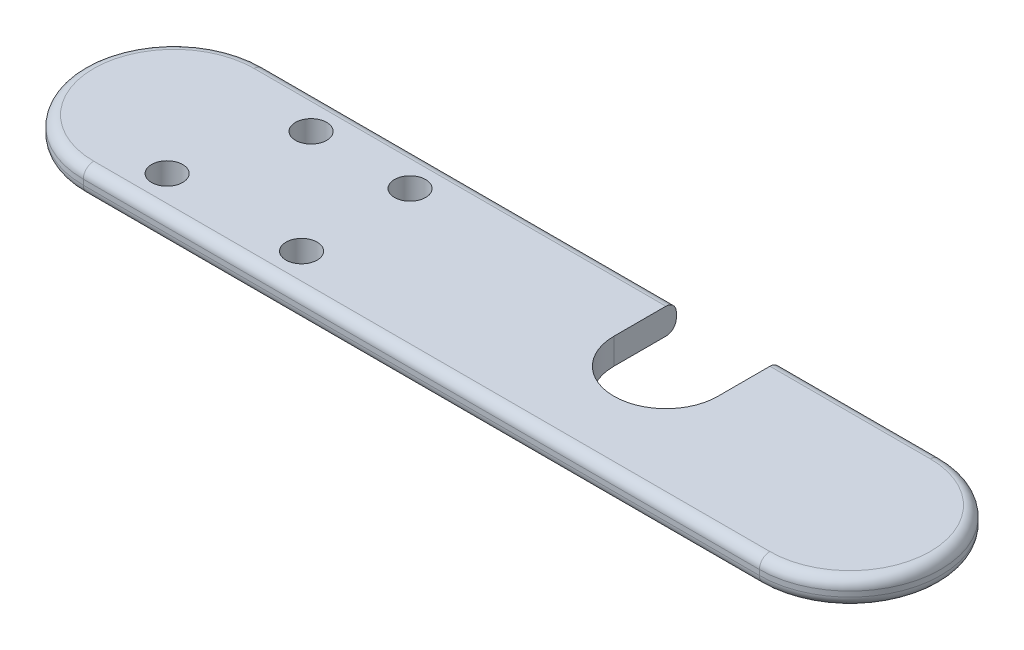
ISO-10303-21;
HEADER;
FILE_DESCRIPTION(('STEP AP214'),'2;1');
FILE_NAME('part.step','',(''),(''),'','','');
FILE_SCHEMA(('AUTOMOTIVE_DESIGN { 1 0 10303 214 1 1 1 1 }'));
ENDSEC;
DATA;
#1=APPLICATION_CONTEXT('core data for automotive mechanical design processes');
#2=APPLICATION_PROTOCOL_DEFINITION('international standard','automotive_design',2000,#1);
#3=PRODUCT_CONTEXT('',#1,'mechanical');
#4=PRODUCT('Part','Part','',(#3));
#5=PRODUCT_RELATED_PRODUCT_CATEGORY('part','',(#4));
#6=PRODUCT_DEFINITION_FORMATION('','',#4);
#7=PRODUCT_DEFINITION_CONTEXT('part definition',#1,'design');
#8=PRODUCT_DEFINITION('design','',#6,#7);
#9=PRODUCT_DEFINITION_SHAPE('','',#8);
#10=(LENGTH_UNIT() NAMED_UNIT(*) SI_UNIT(.MILLI.,.METRE.));
#11=(NAMED_UNIT(*) PLANE_ANGLE_UNIT() SI_UNIT($,.RADIAN.));
#12=(NAMED_UNIT(*) SI_UNIT($,.STERADIAN.) SOLID_ANGLE_UNIT());
#13=UNCERTAINTY_MEASURE_WITH_UNIT(LENGTH_MEASURE(1.E-05),#10,'distance_accuracy_value','');
#14=(GEOMETRIC_REPRESENTATION_CONTEXT(3) GLOBAL_UNCERTAINTY_ASSIGNED_CONTEXT((#13)) GLOBAL_UNIT_ASSIGNED_CONTEXT((#10,
#11,#12)) REPRESENTATION_CONTEXT('',''));
#15=CARTESIAN_POINT('',(0.,0.,0.));
#16=DIRECTION('',(0.,0.,1.));
#17=DIRECTION('',(1.,0.,0.));
#18=AXIS2_PLACEMENT_3D('',#15,#16,#17);
#19=CARTESIAN_POINT('',(-65.005,2.5,-17.43));
#20=DIRECTION('',(0.,0.,1.));
#21=DIRECTION('',(1.,0.,0.));
#22=AXIS2_PLACEMENT_3D('',#19,#20,#21);
#23=PLANE('',#22);
#24=DIRECTION('',(-1.,0.,0.));
#25=VECTOR('',#24,1.);
#26=CARTESIAN_POINT('',(-65.005,-0.5,-17.43));
#27=LINE('',#26,#25);
#28=CARTESIAN_POINT('',(65.005,-0.5,-17.43));
#29=VERTEX_POINT('',#28);
#30=CARTESIAN_POINT('',(34.165,-0.5,-17.43));
#31=VERTEX_POINT('',#30);
#32=EDGE_CURVE('E253',#29,#31,#27,.T.);
#33=ORIENTED_EDGE('',*,*,#32,.T.);
#34=DIRECTION('',(0.,1.,0.));
#35=VECTOR('',#34,1.);
#36=CARTESIAN_POINT('',(34.165,-7.5,-17.43));
#37=LINE('',#36,#35);
#38=CARTESIAN_POINT('',(34.165,0.5,-17.43));
#39=VERTEX_POINT('',#38);
#40=EDGE_CURVE('E172',#31,#39,#37,.T.);
#41=ORIENTED_EDGE('',*,*,#40,.T.);
#42=DIRECTION('',(-1.,0.,0.));
#43=VECTOR('',#42,1.);
#44=CARTESIAN_POINT('',(65.005,0.5,-17.43));
#45=LINE('',#44,#43);
#46=CARTESIAN_POINT('',(65.005,0.5,-17.43));
#47=VERTEX_POINT('',#46);
#48=EDGE_CURVE('E257',#39,#47,#45,.F.);
#49=ORIENTED_EDGE('',*,*,#48,.T.);
#50=DIRECTION('',(0.,-1.,0.));
#51=VECTOR('',#50,1.);
#52=CARTESIAN_POINT('',(65.005,2.5,-17.43));
#53=LINE('',#52,#51);
#54=EDGE_CURVE('E228',#47,#29,#53,.T.);
#55=ORIENTED_EDGE('',*,*,#54,.T.);
#56=EDGE_LOOP('',(#33,#41,#49,#55));
#57=FACE_BOUND('',#56,.T.);
#58=ADVANCED_FACE('F39',(#57),#23,.F.);
#59=CARTESIAN_POINT('',(-65.005,0.5,-15.43));
#60=DIRECTION('',(1.,0.,0.));
#61=DIRECTION('',(0.,0.,-1.));
#62=AXIS2_PLACEMENT_3D('',#59,#60,#61);
#63=CYLINDRICAL_SURFACE('',#62,2.);
#64=CARTESIAN_POINT('',(34.165,0.5,-15.43));
#65=DIRECTION('',(1.,0.,0.));
#66=DIRECTION('',(0.,0.,-1.));
#67=AXIS2_PLACEMENT_3D('',#64,#65,#66);
#68=CIRCLE('',#67,2.);
#69=CARTESIAN_POINT('',(34.165,2.5,-15.43));
#70=VERTEX_POINT('',#69);
#71=EDGE_CURVE('E188',#70,#39,#68,.F.);
#72=ORIENTED_EDGE('',*,*,#71,.F.);
#73=DIRECTION('',(-1.,0.,0.));
#74=VECTOR('',#73,1.);
#75=CARTESIAN_POINT('',(-65.005,2.5,-15.43));
#76=LINE('',#75,#74);
#77=CARTESIAN_POINT('',(65.005,2.5,-15.43));
#78=VERTEX_POINT('',#77);
#79=EDGE_CURVE('E249',#78,#70,#76,.T.);
#80=ORIENTED_EDGE('',*,*,#79,.F.);
#81=CARTESIAN_POINT('',(65.005,0.5,-15.43));
#82=DIRECTION('',(-1.,0.,0.));
#83=DIRECTION('',(0.,0.,1.));
#84=AXIS2_PLACEMENT_3D('',#81,#82,#83);
#85=CIRCLE('',#84,2.);
#86=EDGE_CURVE('E298',#78,#47,#85,.T.);
#87=ORIENTED_EDGE('',*,*,#86,.T.);
#88=ORIENTED_EDGE('',*,*,#48,.F.);
#89=EDGE_LOOP('',(#72,#80,#87,#88));
#90=FACE_BOUND('',#89,.T.);
#91=ADVANCED_FACE('F366',(#90),#63,.T.);
#92=CARTESIAN_POINT('',(-65.005,-0.5,-15.43));
#93=DIRECTION('',(-1.,0.,0.));
#94=DIRECTION('',(0.,0.,1.));
#95=AXIS2_PLACEMENT_3D('',#92,#93,#94);
#96=CYLINDRICAL_SURFACE('',#95,2.);
#97=CARTESIAN_POINT('',(34.165,-0.5,-15.43));
#98=DIRECTION('',(1.,0.,0.));
#99=DIRECTION('',(0.,0.,-1.));
#100=AXIS2_PLACEMENT_3D('',#97,#98,#99);
#101=CIRCLE('',#100,2.);
#102=CARTESIAN_POINT('',(34.165,-2.5,-15.43));
#103=VERTEX_POINT('',#102);
#104=EDGE_CURVE('E48',#31,#103,#101,.F.);
#105=ORIENTED_EDGE('',*,*,#104,.F.);
#106=ORIENTED_EDGE('',*,*,#32,.F.);
#107=CARTESIAN_POINT('',(65.005,-0.5,-15.43));
#108=DIRECTION('',(-1.,0.,0.));
#109=DIRECTION('',(0.,0.,1.));
#110=AXIS2_PLACEMENT_3D('',#107,#108,#109);
#111=CIRCLE('',#110,2.);
#112=CARTESIAN_POINT('',(65.005,-2.5,-15.43));
#113=VERTEX_POINT('',#112);
#114=EDGE_CURVE('E313',#29,#113,#111,.T.);
#115=ORIENTED_EDGE('',*,*,#114,.T.);
#116=DIRECTION('',(-1.,0.,0.));
#117=VECTOR('',#116,1.);
#118=CARTESIAN_POINT('',(-65.005,-2.5,-15.43));
#119=LINE('',#118,#117);
#120=EDGE_CURVE('E277',#103,#113,#119,.F.);
#121=ORIENTED_EDGE('',*,*,#120,.F.);
#122=EDGE_LOOP('',(#105,#106,#115,#121));
#123=FACE_BOUND('',#122,.T.);
#124=ADVANCED_FACE('F335',(#123),#96,.T.);
#125=CARTESIAN_POINT('',(-65.005,2.5,0.));
#126=DIRECTION('',(0.,-1.,0.));
#127=DIRECTION('',(0.,0.,-1.));
#128=AXIS2_PLACEMENT_3D('',#125,#126,#127);
#129=CYLINDRICAL_SURFACE('',#128,17.43);
#130=DIRECTION('',(0.,-1.,0.));
#131=VECTOR('',#130,1.);
#132=CARTESIAN_POINT('',(-65.005,2.5,17.43));
#133=LINE('',#132,#131);
#134=CARTESIAN_POINT('',(-65.005,0.5,17.43));
#135=VERTEX_POINT('',#134);
#136=CARTESIAN_POINT('',(-65.005,-0.5,17.43));
#137=VERTEX_POINT('',#136);
#138=EDGE_CURVE('E236',#135,#137,#133,.T.);
#139=ORIENTED_EDGE('',*,*,#138,.F.);
#140=CARTESIAN_POINT('',(-65.005,0.5,0.));
#141=DIRECTION('',(0.,1.,0.));
#142=DIRECTION('',(0.,0.,1.));
#143=AXIS2_PLACEMENT_3D('',#140,#141,#142);
#144=CIRCLE('',#143,17.43);
#145=CARTESIAN_POINT('',(-65.005,0.5,-17.43));
#146=VERTEX_POINT('',#145);
#147=EDGE_CURVE('E290',#135,#146,#144,.F.);
#148=ORIENTED_EDGE('',*,*,#147,.T.);
#149=DIRECTION('',(0.,-1.,0.));
#150=VECTOR('',#149,1.);
#151=CARTESIAN_POINT('',(-65.005,2.5,-17.43));
#152=LINE('',#151,#150);
#153=CARTESIAN_POINT('',(-65.005,-0.5,-17.43));
#154=VERTEX_POINT('',#153);
#155=EDGE_CURVE('E225',#146,#154,#152,.T.);
#156=ORIENTED_EDGE('',*,*,#155,.T.);
#157=CARTESIAN_POINT('',(-65.005,-0.5,0.));
#158=DIRECTION('',(0.,1.,0.));
#159=DIRECTION('',(0.,0.,1.));
#160=AXIS2_PLACEMENT_3D('',#157,#158,#159);
#161=CIRCLE('',#160,17.43);
#162=EDGE_CURVE('E63',#154,#137,#161,.T.);
#163=ORIENTED_EDGE('',*,*,#162,.T.);
#164=EDGE_LOOP('',(#139,#148,#156,#163));
#165=FACE_BOUND('',#164,.T.);
#166=ADVANCED_FACE('F389',(#165),#129,.T.);
#167=CARTESIAN_POINT('',(-65.005,2.5,17.43));
#168=DIRECTION('',(0.,0.,-1.));
#169=DIRECTION('',(-1.,0.,0.));
#170=AXIS2_PLACEMENT_3D('',#167,#168,#169);
#171=PLANE('',#170);
#172=DIRECTION('',(0.,-1.,0.));
#173=VECTOR('',#172,1.);
#174=CARTESIAN_POINT('',(65.005,2.5,17.4299999999999));
#175=LINE('',#174,#173);
#176=CARTESIAN_POINT('',(65.005,0.5,17.4299999999999));
#177=VERTEX_POINT('',#176);
#178=CARTESIAN_POINT('',(65.005,-0.5,17.4299999999999));
#179=VERTEX_POINT('',#178);
#180=EDGE_CURVE('E232',#177,#179,#175,.T.);
#181=ORIENTED_EDGE('',*,*,#180,.F.);
#182=DIRECTION('',(1.,0.,0.));
#183=VECTOR('',#182,1.);
#184=CARTESIAN_POINT('',(-65.005,0.5,17.43));
#185=LINE('',#184,#183);
#186=EDGE_CURVE('E285',#177,#135,#185,.F.);
#187=ORIENTED_EDGE('',*,*,#186,.T.);
#188=ORIENTED_EDGE('',*,*,#138,.T.);
#189=DIRECTION('',(1.,0.,0.));
#190=VECTOR('',#189,1.);
#191=CARTESIAN_POINT('',(-65.005,-0.5,17.43));
#192=LINE('',#191,#190);
#193=EDGE_CURVE('E282',#137,#179,#192,.T.);
#194=ORIENTED_EDGE('',*,*,#193,.T.);
#195=EDGE_LOOP('',(#181,#187,#188,#194));
#196=FACE_BOUND('',#195,.T.);
#197=ADVANCED_FACE('F392',(#196),#171,.F.);
#198=CARTESIAN_POINT('',(65.005,2.5,0.));
#199=DIRECTION('',(0.,-1.,0.));
#200=DIRECTION('',(0.,0.,-1.));
#201=AXIS2_PLACEMENT_3D('',#198,#199,#200);
#202=CYLINDRICAL_SURFACE('',#201,17.43);
#203=ORIENTED_EDGE('',*,*,#54,.F.);
#204=CARTESIAN_POINT('',(65.005,0.5,0.));
#205=DIRECTION('',(0.,1.,0.));
#206=DIRECTION('',(0.,0.,1.));
#207=AXIS2_PLACEMENT_3D('',#204,#205,#206);
#208=CIRCLE('',#207,17.43);
#209=EDGE_CURVE('E265',#47,#177,#208,.F.);
#210=ORIENTED_EDGE('',*,*,#209,.T.);
#211=ORIENTED_EDGE('',*,*,#180,.T.);
#212=CARTESIAN_POINT('',(65.005,-0.5,0.));
#213=DIRECTION('',(0.,1.,0.));
#214=DIRECTION('',(0.,0.,1.));
#215=AXIS2_PLACEMENT_3D('',#212,#213,#214);
#216=CIRCLE('',#215,17.43);
#217=EDGE_CURVE('E262',#179,#29,#216,.T.);
#218=ORIENTED_EDGE('',*,*,#217,.T.);
#219=EDGE_LOOP('',(#203,#210,#211,#218));
#220=FACE_BOUND('',#219,.T.);
#221=ADVANCED_FACE('F393',(#220),#202,.T.);
#222=CARTESIAN_POINT('',(14.165,0.5,-17.43));
#223=VERTEX_POINT('',#222);
#224=EDGE_CURVE('E258',#146,#223,#45,.F.);
#225=ORIENTED_EDGE('',*,*,#224,.T.);
#226=DIRECTION('',(0.,1.,0.));
#227=VECTOR('',#226,1.);
#228=CARTESIAN_POINT('',(14.165,-7.5,-17.43));
#229=LINE('',#228,#227);
#230=CARTESIAN_POINT('',(14.165,-0.5,-17.43));
#231=VERTEX_POINT('',#230);
#232=EDGE_CURVE('E152',#231,#223,#229,.T.);
#233=ORIENTED_EDGE('',*,*,#232,.F.);
#234=EDGE_CURVE('E252',#231,#154,#27,.T.);
#235=ORIENTED_EDGE('',*,*,#234,.T.);
#236=ORIENTED_EDGE('',*,*,#155,.F.);
#237=EDGE_LOOP('',(#225,#233,#235,#236));
#238=FACE_BOUND('',#237,.T.);
#239=ADVANCED_FACE('F387',(#238),#23,.F.);
#240=CARTESIAN_POINT('',(-65.005,2.5,0.));
#241=DIRECTION('',(0.,1.,0.));
#242=DIRECTION('',(0.,0.,1.));
#243=AXIS2_PLACEMENT_3D('',#240,#241,#242);
#244=PLANE('',#243);
#245=DIRECTION('',(0.,0.,-1.));
#246=VECTOR('',#245,1.);
#247=CARTESIAN_POINT('',(34.165,2.5,-17.43));
#248=LINE('',#247,#246);
#249=CARTESIAN_POINT('',(34.165,2.5,-5.42999999999996));
#250=VERTEX_POINT('',#249);
#251=EDGE_CURVE('E166',#250,#70,#248,.T.);
#252=ORIENTED_EDGE('',*,*,#251,.F.);
#253=CARTESIAN_POINT('',(24.165,2.5,-5.42999999999996));
#254=DIRECTION('',(0.,1.,0.));
#255=DIRECTION('',(0.,0.,-1.));
#256=AXIS2_PLACEMENT_3D('',#253,#254,#255);
#257=CIRCLE('',#256,10.);
#258=CARTESIAN_POINT('',(14.165,2.5,-5.42999999999995));
#259=VERTEX_POINT('',#258);
#260=EDGE_CURVE('E148',#259,#250,#257,.T.);
#261=ORIENTED_EDGE('',*,*,#260,.F.);
#262=DIRECTION('',(0.,0.,1.));
#263=VECTOR('',#262,1.);
#264=CARTESIAN_POINT('',(14.165,2.5,-17.43));
#265=LINE('',#264,#263);
#266=CARTESIAN_POINT('',(14.165,2.5,-15.43));
#267=VERTEX_POINT('',#266);
#268=EDGE_CURVE('E155',#267,#259,#265,.T.);
#269=ORIENTED_EDGE('',*,*,#268,.F.);
#270=CARTESIAN_POINT('',(-65.005,2.5,-15.43));
#271=VERTEX_POINT('',#270);
#272=EDGE_CURVE('E248',#267,#271,#76,.T.);
#273=ORIENTED_EDGE('',*,*,#272,.T.);
#274=CARTESIAN_POINT('',(-65.005,2.5,0.));
#275=DIRECTION('',(0.,1.,0.));
#276=DIRECTION('',(0.,0.,1.));
#277=AXIS2_PLACEMENT_3D('',#274,#275,#276);
#278=CIRCLE('',#277,15.43);
#279=CARTESIAN_POINT('',(-65.005,2.5,15.4299999999999));
#280=VERTEX_POINT('',#279);
#281=EDGE_CURVE('E239',#271,#280,#278,.T.);
#282=ORIENTED_EDGE('',*,*,#281,.T.);
#283=DIRECTION('',(1.,0.,0.));
#284=VECTOR('',#283,1.);
#285=CARTESIAN_POINT('',(65.005,2.5,15.4299999999999));
#286=LINE('',#285,#284);
#287=CARTESIAN_POINT('',(65.005,2.5,15.4299999999999));
#288=VERTEX_POINT('',#287);
#289=EDGE_CURVE('E242',#280,#288,#286,.T.);
#290=ORIENTED_EDGE('',*,*,#289,.T.);
#291=CARTESIAN_POINT('',(65.005,2.5,0.));
#292=DIRECTION('',(0.,1.,0.));
#293=DIRECTION('',(0.,0.,1.));
#294=AXIS2_PLACEMENT_3D('',#291,#292,#293);
#295=CIRCLE('',#294,15.43);
#296=EDGE_CURVE('E245',#288,#78,#295,.T.);
#297=ORIENTED_EDGE('',*,*,#296,.T.);
#298=ORIENTED_EDGE('',*,*,#79,.T.);
#299=EDGE_LOOP('',(#252,#261,#269,#273,#282,#290,#297,#298));
#300=FACE_BOUND('',#299,.T.);
#301=CARTESIAN_POINT('',(-30.035,2.5,-10.43));
#302=DIRECTION('',(0.,1.,0.));
#303=DIRECTION('',(0.,0.,1.));
#304=AXIS2_PLACEMENT_3D('',#301,#302,#303);
#305=CIRCLE('',#304,3.);
#306=CARTESIAN_POINT('',(-30.035,2.5,-7.42999999999998));
#307=VERTEX_POINT('',#306);
#308=EDGE_CURVE('E202',#307,#307,#305,.T.);
#309=ORIENTED_EDGE('',*,*,#308,.F.);
#310=EDGE_LOOP('',(#309));
#311=FACE_BOUND('',#310,.T.);
#312=CARTESIAN_POINT('',(-55.895,2.5,10.43));
#313=DIRECTION('',(0.,1.,0.));
#314=DIRECTION('',(0.,0.,1.));
#315=AXIS2_PLACEMENT_3D('',#312,#313,#314);
#316=CIRCLE('',#315,3.);
#317=CARTESIAN_POINT('',(-55.895,2.5,13.43));
#318=VERTEX_POINT('',#317);
#319=EDGE_CURVE('E201',#318,#318,#316,.T.);
#320=ORIENTED_EDGE('',*,*,#319,.F.);
#321=EDGE_LOOP('',(#320));
#322=FACE_BOUND('',#321,.T.);
#323=CARTESIAN_POINT('',(-30.035,2.5,10.43));
#324=DIRECTION('',(0.,1.,0.));
#325=DIRECTION('',(0.,0.,1.));
#326=AXIS2_PLACEMENT_3D('',#323,#324,#325);
#327=CIRCLE('',#326,3.);
#328=CARTESIAN_POINT('',(-30.035,2.5,13.43));
#329=VERTEX_POINT('',#328);
#330=EDGE_CURVE('E192',#329,#329,#327,.T.);
#331=ORIENTED_EDGE('',*,*,#330,.F.);
#332=EDGE_LOOP('',(#331));
#333=FACE_BOUND('',#332,.T.);
#334=CARTESIAN_POINT('',(-49.065,2.5,-10.43));
#335=DIRECTION('',(0.,1.,0.));
#336=DIRECTION('',(0.,0.,1.));
#337=AXIS2_PLACEMENT_3D('',#334,#335,#336);
#338=CIRCLE('',#337,3.);
#339=CARTESIAN_POINT('',(-49.065,2.5,-7.42999999999998));
#340=VERTEX_POINT('',#339);
#341=EDGE_CURVE('E211',#340,#340,#338,.T.);
#342=ORIENTED_EDGE('',*,*,#341,.F.);
#343=EDGE_LOOP('',(#342));
#344=FACE_BOUND('',#343,.T.);
#345=ADVANCED_FACE('F163',(#300,#311,#322,#333,#344),#244,.T.);
#346=CARTESIAN_POINT('',(-65.005,-2.5,0.));
#347=DIRECTION('',(0.,1.,0.));
#348=DIRECTION('',(0.,0.,1.));
#349=AXIS2_PLACEMENT_3D('',#346,#347,#348);
#350=PLANE('',#349);
#351=CARTESIAN_POINT('',(24.165,-2.5,-5.42999999999996));
#352=DIRECTION('',(0.,1.,0.));
#353=DIRECTION('',(0.,0.,1.));
#354=AXIS2_PLACEMENT_3D('',#351,#352,#353);
#355=CIRCLE('',#354,10.);
#356=CARTESIAN_POINT('',(14.165,-2.5,-5.42999999999995));
#357=VERTEX_POINT('',#356);
#358=CARTESIAN_POINT('',(34.165,-2.5,-5.42999999999996));
#359=VERTEX_POINT('',#358);
#360=EDGE_CURVE('E11',#357,#359,#355,.T.);
#361=ORIENTED_EDGE('',*,*,#360,.T.);
#362=DIRECTION('',(0.,0.,-1.));
#363=VECTOR('',#362,1.);
#364=CARTESIAN_POINT('',(34.1650000000001,-2.5,0.));
#365=LINE('',#364,#363);
#366=EDGE_CURVE('E184',#359,#103,#365,.T.);
#367=ORIENTED_EDGE('',*,*,#366,.T.);
#368=ORIENTED_EDGE('',*,*,#120,.T.);
#369=CARTESIAN_POINT('',(65.005,-2.5,0.));
#370=DIRECTION('',(0.,1.,0.));
#371=DIRECTION('',(0.,0.,1.));
#372=AXIS2_PLACEMENT_3D('',#369,#370,#371);
#373=CIRCLE('',#372,15.43);
#374=CARTESIAN_POINT('',(65.005,-2.5,15.4299999999999));
#375=VERTEX_POINT('',#374);
#376=EDGE_CURVE('E274',#113,#375,#373,.F.);
#377=ORIENTED_EDGE('',*,*,#376,.T.);
#378=DIRECTION('',(1.,0.,0.));
#379=VECTOR('',#378,1.);
#380=CARTESIAN_POINT('',(-65.005,-2.5,15.43));
#381=LINE('',#380,#379);
#382=CARTESIAN_POINT('',(-65.005,-2.5,15.4299999999999));
#383=VERTEX_POINT('',#382);
#384=EDGE_CURVE('E271',#375,#383,#381,.F.);
#385=ORIENTED_EDGE('',*,*,#384,.T.);
#386=CARTESIAN_POINT('',(-65.005,-2.5,0.));
#387=DIRECTION('',(0.,1.,0.));
#388=DIRECTION('',(0.,0.,1.));
#389=AXIS2_PLACEMENT_3D('',#386,#387,#388);
#390=CIRCLE('',#389,15.43);
#391=CARTESIAN_POINT('',(-65.005,-2.5,-15.43));
#392=VERTEX_POINT('',#391);
#393=EDGE_CURVE('E268',#383,#392,#390,.F.);
#394=ORIENTED_EDGE('',*,*,#393,.T.);
#395=CARTESIAN_POINT('',(14.165,-2.5,-15.43));
#396=VERTEX_POINT('',#395);
#397=EDGE_CURVE('E278',#392,#396,#119,.F.);
#398=ORIENTED_EDGE('',*,*,#397,.T.);
#399=DIRECTION('',(0.,0.,1.));
#400=VECTOR('',#399,1.);
#401=CARTESIAN_POINT('',(14.165,-2.5,0.));
#402=LINE('',#401,#400);
#403=EDGE_CURVE('E55',#396,#357,#402,.T.);
#404=ORIENTED_EDGE('',*,*,#403,.T.);
#405=EDGE_LOOP('',(#361,#367,#368,#377,#385,#394,#398,#404));
#406=FACE_BOUND('',#405,.T.);
#407=CARTESIAN_POINT('',(-30.035,-2.5,-10.43));
#408=DIRECTION('',(0.,1.,0.));
#409=DIRECTION('',(0.,0.,1.));
#410=AXIS2_PLACEMENT_3D('',#407,#408,#409);
#411=CIRCLE('',#410,3.);
#412=CARTESIAN_POINT('',(-30.035,-2.5,-7.42999999999998));
#413=VERTEX_POINT('',#412);
#414=EDGE_CURVE('E206',#413,#413,#411,.F.);
#415=ORIENTED_EDGE('',*,*,#414,.F.);
#416=EDGE_LOOP('',(#415));
#417=FACE_BOUND('',#416,.T.);
#418=CARTESIAN_POINT('',(-55.895,-2.5,10.43));
#419=DIRECTION('',(0.,1.,0.));
#420=DIRECTION('',(0.,0.,1.));
#421=AXIS2_PLACEMENT_3D('',#418,#419,#420);
#422=CIRCLE('',#421,3.);
#423=CARTESIAN_POINT('',(-55.895,-2.5,13.43));
#424=VERTEX_POINT('',#423);
#425=EDGE_CURVE('E207',#424,#424,#422,.F.);
#426=ORIENTED_EDGE('',*,*,#425,.F.);
#427=EDGE_LOOP('',(#426));
#428=FACE_BOUND('',#427,.T.);
#429=CARTESIAN_POINT('',(-30.035,-2.5,10.43));
#430=DIRECTION('',(0.,1.,0.));
#431=DIRECTION('',(0.,0.,1.));
#432=AXIS2_PLACEMENT_3D('',#429,#430,#431);
#433=CIRCLE('',#432,3.);
#434=CARTESIAN_POINT('',(-30.035,-2.5,13.43));
#435=VERTEX_POINT('',#434);
#436=EDGE_CURVE('E196',#435,#435,#433,.F.);
#437=ORIENTED_EDGE('',*,*,#436,.F.);
#438=EDGE_LOOP('',(#437));
#439=FACE_BOUND('',#438,.T.);
#440=CARTESIAN_POINT('',(-49.065,-2.5,-10.43));
#441=DIRECTION('',(0.,1.,0.));
#442=DIRECTION('',(0.,0.,1.));
#443=AXIS2_PLACEMENT_3D('',#440,#441,#442);
#444=CIRCLE('',#443,3.);
#445=CARTESIAN_POINT('',(-49.065,-2.5,-7.42999999999998));
#446=VERTEX_POINT('',#445);
#447=EDGE_CURVE('E221',#446,#446,#444,.F.);
#448=ORIENTED_EDGE('',*,*,#447,.F.);
#449=EDGE_LOOP('',(#448));
#450=FACE_BOUND('',#449,.T.);
#451=ADVANCED_FACE('F333',(#406,#417,#428,#439,#450),#350,.F.);
#452=CARTESIAN_POINT('',(-49.065,-2.501,-10.43));
#453=DIRECTION('',(0.,1.,0.));
#454=DIRECTION('',(0.,0.,1.));
#455=AXIS2_PLACEMENT_3D('',#452,#453,#454);
#456=CYLINDRICAL_SURFACE('',#455,3.);
#457=ORIENTED_EDGE('',*,*,#341,.T.);
#458=EDGE_LOOP('',(#457));
#459=FACE_BOUND('',#458,.T.);
#460=ORIENTED_EDGE('',*,*,#447,.T.);
#461=EDGE_LOOP('',(#460));
#462=FACE_BOUND('',#461,.T.);
#463=ADVANCED_FACE('F410',(#459,#462),#456,.F.);
#464=CARTESIAN_POINT('',(-30.035,-2.501,10.43));
#465=DIRECTION('',(0.,1.,0.));
#466=DIRECTION('',(0.,0.,1.));
#467=AXIS2_PLACEMENT_3D('',#464,#465,#466);
#468=CYLINDRICAL_SURFACE('',#467,3.);
#469=ORIENTED_EDGE('',*,*,#330,.T.);
#470=EDGE_LOOP('',(#469));
#471=FACE_BOUND('',#470,.T.);
#472=ORIENTED_EDGE('',*,*,#436,.T.);
#473=EDGE_LOOP('',(#472));
#474=FACE_BOUND('',#473,.T.);
#475=ADVANCED_FACE('F415',(#471,#474),#468,.F.);
#476=CARTESIAN_POINT('',(-55.895,-2.501,10.43));
#477=DIRECTION('',(0.,1.,0.));
#478=DIRECTION('',(0.,0.,1.));
#479=AXIS2_PLACEMENT_3D('',#476,#477,#478);
#480=CYLINDRICAL_SURFACE('',#479,3.);
#481=ORIENTED_EDGE('',*,*,#319,.T.);
#482=EDGE_LOOP('',(#481));
#483=FACE_BOUND('',#482,.T.);
#484=ORIENTED_EDGE('',*,*,#425,.T.);
#485=EDGE_LOOP('',(#484));
#486=FACE_BOUND('',#485,.T.);
#487=ADVANCED_FACE('F417',(#483,#486),#480,.F.);
#488=CARTESIAN_POINT('',(-30.035,-2.501,-10.43));
#489=DIRECTION('',(0.,1.,0.));
#490=DIRECTION('',(0.,0.,1.));
#491=AXIS2_PLACEMENT_3D('',#488,#489,#490);
#492=CYLINDRICAL_SURFACE('',#491,3.);
#493=ORIENTED_EDGE('',*,*,#308,.T.);
#494=EDGE_LOOP('',(#493));
#495=FACE_BOUND('',#494,.T.);
#496=ORIENTED_EDGE('',*,*,#414,.T.);
#497=EDGE_LOOP('',(#496));
#498=FACE_BOUND('',#497,.T.);
#499=ADVANCED_FACE('F420',(#495,#498),#492,.F.);
#500=CARTESIAN_POINT('',(-65.005,0.5,15.43));
#501=DIRECTION('',(-1.,0.,0.));
#502=DIRECTION('',(0.,0.,1.));
#503=AXIS2_PLACEMENT_3D('',#500,#501,#502);
#504=CYLINDRICAL_SURFACE('',#503,2.);
#505=CARTESIAN_POINT('',(-65.005,0.5,15.43));
#506=DIRECTION('',(-1.,0.,0.));
#507=DIRECTION('',(0.,0.,1.));
#508=AXIS2_PLACEMENT_3D('',#505,#506,#507);
#509=CIRCLE('',#508,2.);
#510=EDGE_CURVE('E303',#135,#280,#509,.T.);
#511=ORIENTED_EDGE('',*,*,#510,.F.);
#512=ORIENTED_EDGE('',*,*,#186,.F.);
#513=CARTESIAN_POINT('',(65.005,0.5,15.4299999999999));
#514=DIRECTION('',(1.,0.,0.));
#515=DIRECTION('',(0.,0.,-1.));
#516=AXIS2_PLACEMENT_3D('',#513,#514,#515);
#517=CIRCLE('',#516,2.);
#518=EDGE_CURVE('E197',#288,#177,#517,.T.);
#519=ORIENTED_EDGE('',*,*,#518,.F.);
#520=ORIENTED_EDGE('',*,*,#289,.F.);
#521=EDGE_LOOP('',(#511,#512,#519,#520));
#522=FACE_BOUND('',#521,.T.);
#523=ADVANCED_FACE('F354',(#522),#504,.T.);
#524=CARTESIAN_POINT('',(65.005,0.5,0.));
#525=DIRECTION('',(0.,1.,0.));
#526=DIRECTION('',(0.,0.,1.));
#527=AXIS2_PLACEMENT_3D('',#524,#525,#526);
#528=TOROIDAL_SURFACE('',#527,15.43,2.);
#529=ORIENTED_EDGE('',*,*,#518,.T.);
#530=ORIENTED_EDGE('',*,*,#209,.F.);
#531=ORIENTED_EDGE('',*,*,#86,.F.);
#532=ORIENTED_EDGE('',*,*,#296,.F.);
#533=EDGE_LOOP('',(#529,#530,#531,#532));
#534=FACE_BOUND('',#533,.T.);
#535=ADVANCED_FACE('F361',(#534),#528,.T.);
#536=CARTESIAN_POINT('',(-65.005,0.5,0.));
#537=DIRECTION('',(0.,1.,0.));
#538=DIRECTION('',(0.,0.,1.));
#539=AXIS2_PLACEMENT_3D('',#536,#537,#538);
#540=TOROIDAL_SURFACE('',#539,15.43,2.);
#541=ORIENTED_EDGE('',*,*,#510,.T.);
#542=ORIENTED_EDGE('',*,*,#281,.F.);
#543=CARTESIAN_POINT('',(-65.005,0.5,-15.43));
#544=DIRECTION('',(1.,0.,0.));
#545=DIRECTION('',(0.,0.,-1.));
#546=AXIS2_PLACEMENT_3D('',#543,#544,#545);
#547=CIRCLE('',#546,2.);
#548=EDGE_CURVE('E294',#146,#271,#547,.T.);
#549=ORIENTED_EDGE('',*,*,#548,.F.);
#550=ORIENTED_EDGE('',*,*,#147,.F.);
#551=EDGE_LOOP('',(#541,#542,#549,#550));
#552=FACE_BOUND('',#551,.T.);
#553=ADVANCED_FACE('F350',(#552),#540,.T.);
#554=CARTESIAN_POINT('',(14.165,0.5,-15.43));
#555=DIRECTION('',(-1.,0.,0.));
#556=DIRECTION('',(0.,0.,1.));
#557=AXIS2_PLACEMENT_3D('',#554,#555,#556);
#558=CIRCLE('',#557,2.);
#559=EDGE_CURVE('E158',#223,#267,#558,.F.);
#560=ORIENTED_EDGE('',*,*,#559,.F.);
#561=ORIENTED_EDGE('',*,*,#224,.F.);
#562=ORIENTED_EDGE('',*,*,#548,.T.);
#563=ORIENTED_EDGE('',*,*,#272,.F.);
#564=EDGE_LOOP('',(#560,#561,#562,#563));
#565=FACE_BOUND('',#564,.T.);
#566=ADVANCED_FACE('F347',(#565),#63,.T.);
#567=CARTESIAN_POINT('',(-65.005,-0.5,15.43));
#568=DIRECTION('',(1.,0.,0.));
#569=DIRECTION('',(0.,0.,-1.));
#570=AXIS2_PLACEMENT_3D('',#567,#568,#569);
#571=CYLINDRICAL_SURFACE('',#570,2.);
#572=CARTESIAN_POINT('',(-65.005,-0.5,15.43));
#573=DIRECTION('',(-1.,0.,0.));
#574=DIRECTION('',(0.,0.,1.));
#575=AXIS2_PLACEMENT_3D('',#572,#573,#574);
#576=CIRCLE('',#575,2.);
#577=EDGE_CURVE('E317',#383,#137,#576,.T.);
#578=ORIENTED_EDGE('',*,*,#577,.F.);
#579=ORIENTED_EDGE('',*,*,#384,.F.);
#580=CARTESIAN_POINT('',(65.005,-0.5,15.4299999999999));
#581=DIRECTION('',(1.,0.,0.));
#582=DIRECTION('',(0.,0.,-1.));
#583=AXIS2_PLACEMENT_3D('',#580,#581,#582);
#584=CIRCLE('',#583,2.);
#585=EDGE_CURVE('E299',#179,#375,#584,.T.);
#586=ORIENTED_EDGE('',*,*,#585,.F.);
#587=ORIENTED_EDGE('',*,*,#193,.F.);
#588=EDGE_LOOP('',(#578,#579,#586,#587));
#589=FACE_BOUND('',#588,.T.);
#590=ADVANCED_FACE('F41',(#589),#571,.T.);
#591=CARTESIAN_POINT('',(65.005,-0.5,0.));
#592=DIRECTION('',(0.,1.,0.));
#593=DIRECTION('',(0.,0.,1.));
#594=AXIS2_PLACEMENT_3D('',#591,#592,#593);
#595=TOROIDAL_SURFACE('',#594,15.43,2.);
#596=ORIENTED_EDGE('',*,*,#585,.T.);
#597=ORIENTED_EDGE('',*,*,#376,.F.);
#598=ORIENTED_EDGE('',*,*,#114,.F.);
#599=ORIENTED_EDGE('',*,*,#217,.F.);
#600=EDGE_LOOP('',(#596,#597,#598,#599));
#601=FACE_BOUND('',#600,.T.);
#602=ADVANCED_FACE('F371',(#601),#595,.T.);
#603=CARTESIAN_POINT('',(-65.005,-0.5,0.));
#604=DIRECTION('',(0.,1.,0.));
#605=DIRECTION('',(0.,0.,1.));
#606=AXIS2_PLACEMENT_3D('',#603,#604,#605);
#607=TOROIDAL_SURFACE('',#606,15.43,2.);
#608=ORIENTED_EDGE('',*,*,#577,.T.);
#609=ORIENTED_EDGE('',*,*,#162,.F.);
#610=CARTESIAN_POINT('',(-65.005,-0.5,-15.43));
#611=DIRECTION('',(1.,0.,0.));
#612=DIRECTION('',(0.,0.,-1.));
#613=AXIS2_PLACEMENT_3D('',#610,#611,#612);
#614=CIRCLE('',#613,2.);
#615=EDGE_CURVE('E191',#392,#154,#614,.T.);
#616=ORIENTED_EDGE('',*,*,#615,.F.);
#617=ORIENTED_EDGE('',*,*,#393,.F.);
#618=EDGE_LOOP('',(#608,#609,#616,#617));
#619=FACE_BOUND('',#618,.T.);
#620=ADVANCED_FACE('F380',(#619),#607,.T.);
#621=CARTESIAN_POINT('',(14.165,-0.5,-15.43));
#622=DIRECTION('',(-1.,0.,0.));
#623=DIRECTION('',(0.,0.,1.));
#624=AXIS2_PLACEMENT_3D('',#621,#622,#623);
#625=CIRCLE('',#624,2.);
#626=EDGE_CURVE('E293',#396,#231,#625,.F.);
#627=ORIENTED_EDGE('',*,*,#626,.F.);
#628=ORIENTED_EDGE('',*,*,#397,.F.);
#629=ORIENTED_EDGE('',*,*,#615,.T.);
#630=ORIENTED_EDGE('',*,*,#234,.F.);
#631=EDGE_LOOP('',(#627,#628,#629,#630));
#632=FACE_BOUND('',#631,.T.);
#633=ADVANCED_FACE('F383',(#632),#96,.T.);
#634=CARTESIAN_POINT('',(24.165,-7.5,-5.42999999999996));
#635=DIRECTION('',(0.,1.,0.));
#636=DIRECTION('',(0.,0.,1.));
#637=AXIS2_PLACEMENT_3D('',#634,#635,#636);
#638=CYLINDRICAL_SURFACE('',#637,10.);
#639=DIRECTION('',(0.,1.,0.));
#640=VECTOR('',#639,1.);
#641=CARTESIAN_POINT('',(14.165,-7.5,-5.42999999999995));
#642=LINE('',#641,#640);
#643=EDGE_CURVE('E143',#357,#259,#642,.T.);
#644=ORIENTED_EDGE('',*,*,#643,.T.);
#645=ORIENTED_EDGE('',*,*,#260,.T.);
#646=DIRECTION('',(0.,1.,0.));
#647=VECTOR('',#646,1.);
#648=CARTESIAN_POINT('',(34.165,-7.5,-5.42999999999996));
#649=LINE('',#648,#647);
#650=EDGE_CURVE('E151',#359,#250,#649,.T.);
#651=ORIENTED_EDGE('',*,*,#650,.F.);
#652=ORIENTED_EDGE('',*,*,#360,.F.);
#653=EDGE_LOOP('',(#644,#645,#651,#652));
#654=FACE_BOUND('',#653,.T.);
#655=ADVANCED_FACE('F145',(#654),#638,.F.);
#656=CARTESIAN_POINT('',(34.165,-7.5,-17.43));
#657=DIRECTION('',(1.,0.,0.));
#658=DIRECTION('',(0.,0.,-1.));
#659=AXIS2_PLACEMENT_3D('',#656,#657,#658);
#660=PLANE('',#659);
#661=ORIENTED_EDGE('',*,*,#71,.T.);
#662=ORIENTED_EDGE('',*,*,#40,.F.);
#663=ORIENTED_EDGE('',*,*,#104,.T.);
#664=ORIENTED_EDGE('',*,*,#366,.F.);
#665=ORIENTED_EDGE('',*,*,#650,.T.);
#666=ORIENTED_EDGE('',*,*,#251,.T.);
#667=EDGE_LOOP('',(#661,#662,#663,#664,#665,#666));
#668=FACE_BOUND('',#667,.T.);
#669=ADVANCED_FACE('F328',(#668),#660,.F.);
#670=CARTESIAN_POINT('',(14.165,-7.5,-17.43));
#671=DIRECTION('',(-1.,0.,0.));
#672=DIRECTION('',(0.,0.,1.));
#673=AXIS2_PLACEMENT_3D('',#670,#671,#672);
#674=PLANE('',#673);
#675=ORIENTED_EDGE('',*,*,#559,.T.);
#676=ORIENTED_EDGE('',*,*,#268,.T.);
#677=ORIENTED_EDGE('',*,*,#643,.F.);
#678=ORIENTED_EDGE('',*,*,#403,.F.);
#679=ORIENTED_EDGE('',*,*,#626,.T.);
#680=ORIENTED_EDGE('',*,*,#232,.T.);
#681=EDGE_LOOP('',(#675,#676,#677,#678,#679,#680));
#682=FACE_BOUND('',#681,.T.);
#683=ADVANCED_FACE('F156',(#682),#674,.F.);
#684=CLOSED_SHELL('',(#58,#91,#124,#166,#197,#221,#239,#345,#451,#463,#475,#487,#499,#523,#535,
#553,#566,#590,#602,#620,#633,#655,#669,#683));
#685=MANIFOLD_SOLID_BREP('B2',#684);
#686=ADVANCED_BREP_SHAPE_REPRESENTATION('',(#18,#685),#14);
#687=SHAPE_DEFINITION_REPRESENTATION(#9,#686);
ENDSEC;
END-ISO-10303-21;
